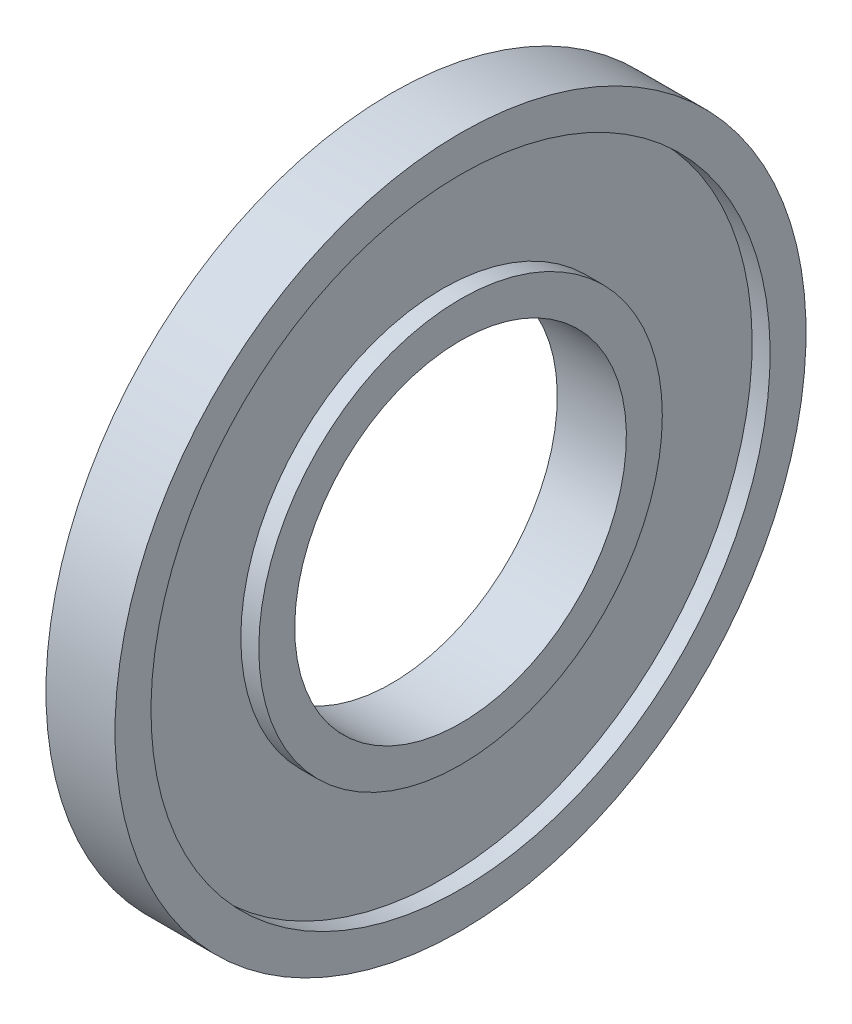
ISO-10303-21;
HEADER;
FILE_DESCRIPTION(('STEP AP214'),'2;1');
FILE_NAME('part.step','',(''),(''),'','','');
FILE_SCHEMA(('AUTOMOTIVE_DESIGN { 1 0 10303 214 1 1 1 1 }'));
ENDSEC;
DATA;
#1=APPLICATION_CONTEXT('core data for automotive mechanical design processes');
#2=APPLICATION_PROTOCOL_DEFINITION('international standard','automotive_design',2000,#1);
#3=PRODUCT_CONTEXT('',#1,'mechanical');
#4=PRODUCT('Part','Part','',(#3));
#5=PRODUCT_RELATED_PRODUCT_CATEGORY('part','',(#4));
#6=PRODUCT_DEFINITION_FORMATION('','',#4);
#7=PRODUCT_DEFINITION_CONTEXT('part definition',#1,'design');
#8=PRODUCT_DEFINITION('design','',#6,#7);
#9=PRODUCT_DEFINITION_SHAPE('','',#8);
#10=(LENGTH_UNIT() NAMED_UNIT(*) SI_UNIT(.MILLI.,.METRE.));
#11=(NAMED_UNIT(*) PLANE_ANGLE_UNIT() SI_UNIT($,.RADIAN.));
#12=(NAMED_UNIT(*) SI_UNIT($,.STERADIAN.) SOLID_ANGLE_UNIT());
#13=UNCERTAINTY_MEASURE_WITH_UNIT(LENGTH_MEASURE(1.E-05),#10,'distance_accuracy_value','');
#14=(GEOMETRIC_REPRESENTATION_CONTEXT(3) GLOBAL_UNCERTAINTY_ASSIGNED_CONTEXT((#13)) GLOBAL_UNIT_ASSIGNED_CONTEXT((#10,
#11,#12)) REPRESENTATION_CONTEXT('',''));
#15=CARTESIAN_POINT('',(0.,0.,0.));
#16=DIRECTION('',(0.,0.,1.));
#17=DIRECTION('',(1.,0.,0.));
#18=AXIS2_PLACEMENT_3D('',#15,#16,#17);
#19=CARTESIAN_POINT('',(-2.5,14.6,0.));
#20=DIRECTION('',(-1.,0.,0.));
#21=DIRECTION('',(0.,-1.,0.));
#22=AXIS2_PLACEMENT_3D('',#19,#20,#21);
#23=PLANE('',#22);
#24=CARTESIAN_POINT('',(-2.5,0.,0.));
#25=DIRECTION('',(1.,0.,0.));
#26=DIRECTION('',(0.,1.,0.));
#27=AXIS2_PLACEMENT_3D('',#24,#25,#26);
#28=CIRCLE('',#27,12.);
#29=CARTESIAN_POINT('',(-2.5,12.,0.));
#30=VERTEX_POINT('',#29);
#31=EDGE_CURVE('E75',#30,#30,#28,.T.);
#32=ORIENTED_EDGE('',*,*,#31,.T.);
#33=EDGE_LOOP('',(#32));
#34=FACE_BOUND('',#33,.T.);
#35=CARTESIAN_POINT('',(-2.5,0.,0.));
#36=DIRECTION('',(1.,0.,0.));
#37=DIRECTION('',(0.,1.,0.));
#38=AXIS2_PLACEMENT_3D('',#35,#36,#37);
#39=CIRCLE('',#38,14.6);
#40=CARTESIAN_POINT('',(-2.5,14.6,0.));
#41=VERTEX_POINT('',#40);
#42=EDGE_CURVE('E10',#41,#41,#39,.T.);
#43=ORIENTED_EDGE('',*,*,#42,.F.);
#44=EDGE_LOOP('',(#43));
#45=FACE_BOUND('',#44,.T.);
#46=ADVANCED_FACE('F35',(#34,#45),#23,.T.);
#47=CARTESIAN_POINT('',(6.48120818860915,0.,0.));
#48=DIRECTION('',(1.,0.,0.));
#49=DIRECTION('',(0.,1.,0.));
#50=AXIS2_PLACEMENT_3D('',#47,#48,#49);
#51=CYLINDRICAL_SURFACE('',#50,14.6);
#52=ORIENTED_EDGE('',*,*,#42,.T.);
#53=EDGE_LOOP('',(#52));
#54=FACE_BOUND('',#53,.T.);
#55=CARTESIAN_POINT('',(-1.2,0.,0.));
#56=DIRECTION('',(1.,0.,0.));
#57=DIRECTION('',(0.,1.,0.));
#58=AXIS2_PLACEMENT_3D('',#55,#56,#57);
#59=CIRCLE('',#58,14.6);
#60=CARTESIAN_POINT('',(-1.2,14.6,0.));
#61=VERTEX_POINT('',#60);
#62=EDGE_CURVE('E41',#61,#61,#59,.T.);
#63=ORIENTED_EDGE('',*,*,#62,.F.);
#64=EDGE_LOOP('',(#63));
#65=FACE_BOUND('',#64,.T.);
#66=ADVANCED_FACE('F93',(#54,#65),#51,.T.);
#67=CARTESIAN_POINT('',(-1.2,22.4,0.));
#68=DIRECTION('',(-1.,0.,0.));
#69=DIRECTION('',(0.,-1.,0.));
#70=AXIS2_PLACEMENT_3D('',#67,#68,#69);
#71=PLANE('',#70);
#72=ORIENTED_EDGE('',*,*,#62,.T.);
#73=EDGE_LOOP('',(#72));
#74=FACE_BOUND('',#73,.T.);
#75=CARTESIAN_POINT('',(-1.2,0.,0.));
#76=DIRECTION('',(1.,0.,0.));
#77=DIRECTION('',(0.,1.,0.));
#78=AXIS2_PLACEMENT_3D('',#75,#76,#77);
#79=CIRCLE('',#78,22.4);
#80=CARTESIAN_POINT('',(-1.2,22.4,0.));
#81=VERTEX_POINT('',#80);
#82=EDGE_CURVE('E45',#81,#81,#79,.T.);
#83=ORIENTED_EDGE('',*,*,#82,.F.);
#84=EDGE_LOOP('',(#83));
#85=FACE_BOUND('',#84,.T.);
#86=ADVANCED_FACE('F97',(#74,#85),#71,.T.);
#87=CARTESIAN_POINT('',(6.48120818860915,0.,0.));
#88=DIRECTION('',(1.,0.,0.));
#89=DIRECTION('',(0.,1.,0.));
#90=AXIS2_PLACEMENT_3D('',#87,#88,#89);
#91=CYLINDRICAL_SURFACE('',#90,22.4);
#92=ORIENTED_EDGE('',*,*,#82,.T.);
#93=EDGE_LOOP('',(#92));
#94=FACE_BOUND('',#93,.T.);
#95=CARTESIAN_POINT('',(-2.5,0.,0.));
#96=DIRECTION('',(1.,0.,0.));
#97=DIRECTION('',(0.,1.,0.));
#98=AXIS2_PLACEMENT_3D('',#95,#96,#97);
#99=CIRCLE('',#98,22.4);
#100=CARTESIAN_POINT('',(-2.5,22.4,0.));
#101=VERTEX_POINT('',#100);
#102=EDGE_CURVE('E49',#101,#101,#99,.T.);
#103=ORIENTED_EDGE('',*,*,#102,.F.);
#104=EDGE_LOOP('',(#103));
#105=FACE_BOUND('',#104,.T.);
#106=ADVANCED_FACE('F101',(#94,#105),#91,.F.);
#107=CARTESIAN_POINT('',(-2.5,25.,0.));
#108=DIRECTION('',(-1.,0.,0.));
#109=DIRECTION('',(0.,-1.,0.));
#110=AXIS2_PLACEMENT_3D('',#107,#108,#109);
#111=PLANE('',#110);
#112=ORIENTED_EDGE('',*,*,#102,.T.);
#113=EDGE_LOOP('',(#112));
#114=FACE_BOUND('',#113,.T.);
#115=CARTESIAN_POINT('',(-2.5,0.,0.));
#116=DIRECTION('',(1.,0.,0.));
#117=DIRECTION('',(0.,1.,0.));
#118=AXIS2_PLACEMENT_3D('',#115,#116,#117);
#119=CIRCLE('',#118,25.);
#120=CARTESIAN_POINT('',(-2.5,25.,0.));
#121=VERTEX_POINT('',#120);
#122=EDGE_CURVE('E54',#121,#121,#119,.T.);
#123=ORIENTED_EDGE('',*,*,#122,.F.);
#124=EDGE_LOOP('',(#123));
#125=FACE_BOUND('',#124,.T.);
#126=ADVANCED_FACE('F107',(#114,#125),#111,.T.);
#127=CARTESIAN_POINT('',(6.48120818860915,0.,0.));
#128=DIRECTION('',(1.,0.,0.));
#129=DIRECTION('',(0.,1.,0.));
#130=AXIS2_PLACEMENT_3D('',#127,#128,#129);
#131=CYLINDRICAL_SURFACE('',#130,25.);
#132=ORIENTED_EDGE('',*,*,#122,.T.);
#133=EDGE_LOOP('',(#132));
#134=FACE_BOUND('',#133,.T.);
#135=CARTESIAN_POINT('',(2.5,0.,0.));
#136=DIRECTION('',(1.,0.,0.));
#137=DIRECTION('',(0.,1.,0.));
#138=AXIS2_PLACEMENT_3D('',#135,#136,#137);
#139=CIRCLE('',#138,25.);
#140=CARTESIAN_POINT('',(2.5,25.,0.));
#141=VERTEX_POINT('',#140);
#142=EDGE_CURVE('E57',#141,#141,#139,.T.);
#143=ORIENTED_EDGE('',*,*,#142,.F.);
#144=EDGE_LOOP('',(#143));
#145=FACE_BOUND('',#144,.T.);
#146=ADVANCED_FACE('F111',(#134,#145),#131,.T.);
#147=CARTESIAN_POINT('',(2.5,25.,0.));
#148=DIRECTION('',(1.,0.,0.));
#149=DIRECTION('',(0.,1.,0.));
#150=AXIS2_PLACEMENT_3D('',#147,#148,#149);
#151=PLANE('',#150);
#152=ORIENTED_EDGE('',*,*,#142,.T.);
#153=EDGE_LOOP('',(#152));
#154=FACE_BOUND('',#153,.T.);
#155=CARTESIAN_POINT('',(2.5,0.,0.));
#156=DIRECTION('',(1.,0.,0.));
#157=DIRECTION('',(0.,1.,0.));
#158=AXIS2_PLACEMENT_3D('',#155,#156,#157);
#159=CIRCLE('',#158,22.4);
#160=CARTESIAN_POINT('',(2.5,22.4,0.));
#161=VERTEX_POINT('',#160);
#162=EDGE_CURVE('E60',#161,#161,#159,.T.);
#163=ORIENTED_EDGE('',*,*,#162,.F.);
#164=EDGE_LOOP('',(#163));
#165=FACE_BOUND('',#164,.T.);
#166=ADVANCED_FACE('F115',(#154,#165),#151,.T.);
#167=CARTESIAN_POINT('',(6.48120818860915,0.,0.));
#168=DIRECTION('',(1.,0.,0.));
#169=DIRECTION('',(0.,1.,0.));
#170=AXIS2_PLACEMENT_3D('',#167,#168,#169);
#171=CYLINDRICAL_SURFACE('',#170,22.4);
#172=ORIENTED_EDGE('',*,*,#162,.T.);
#173=EDGE_LOOP('',(#172));
#174=FACE_BOUND('',#173,.T.);
#175=CARTESIAN_POINT('',(1.20000000000001,0.,0.));
#176=DIRECTION('',(1.,0.,0.));
#177=DIRECTION('',(0.,1.,0.));
#178=AXIS2_PLACEMENT_3D('',#175,#176,#177);
#179=CIRCLE('',#178,22.4);
#180=CARTESIAN_POINT('',(1.20000000000001,22.4,0.));
#181=VERTEX_POINT('',#180);
#182=EDGE_CURVE('E63',#181,#181,#179,.T.);
#183=ORIENTED_EDGE('',*,*,#182,.F.);
#184=EDGE_LOOP('',(#183));
#185=FACE_BOUND('',#184,.T.);
#186=ADVANCED_FACE('F119',(#174,#185),#171,.F.);
#187=CARTESIAN_POINT('',(1.2,22.4,0.));
#188=DIRECTION('',(1.,0.,0.));
#189=DIRECTION('',(0.,1.,0.));
#190=AXIS2_PLACEMENT_3D('',#187,#188,#189);
#191=PLANE('',#190);
#192=ORIENTED_EDGE('',*,*,#182,.T.);
#193=EDGE_LOOP('',(#192));
#194=FACE_BOUND('',#193,.T.);
#195=CARTESIAN_POINT('',(1.20000000000001,0.,0.));
#196=DIRECTION('',(1.,0.,0.));
#197=DIRECTION('',(0.,1.,0.));
#198=AXIS2_PLACEMENT_3D('',#195,#196,#197);
#199=CIRCLE('',#198,14.6);
#200=CARTESIAN_POINT('',(1.20000000000001,14.6,0.));
#201=VERTEX_POINT('',#200);
#202=EDGE_CURVE('E66',#201,#201,#199,.T.);
#203=ORIENTED_EDGE('',*,*,#202,.F.);
#204=EDGE_LOOP('',(#203));
#205=FACE_BOUND('',#204,.T.);
#206=ADVANCED_FACE('F123',(#194,#205),#191,.T.);
#207=CARTESIAN_POINT('',(6.48120818860915,0.,0.));
#208=DIRECTION('',(1.,0.,0.));
#209=DIRECTION('',(0.,1.,0.));
#210=AXIS2_PLACEMENT_3D('',#207,#208,#209);
#211=CYLINDRICAL_SURFACE('',#210,14.6);
#212=ORIENTED_EDGE('',*,*,#202,.T.);
#213=EDGE_LOOP('',(#212));
#214=FACE_BOUND('',#213,.T.);
#215=CARTESIAN_POINT('',(2.5,0.,0.));
#216=DIRECTION('',(1.,0.,0.));
#217=DIRECTION('',(0.,1.,0.));
#218=AXIS2_PLACEMENT_3D('',#215,#216,#217);
#219=CIRCLE('',#218,14.6);
#220=CARTESIAN_POINT('',(2.5,14.6,0.));
#221=VERTEX_POINT('',#220);
#222=EDGE_CURVE('E69',#221,#221,#219,.T.);
#223=ORIENTED_EDGE('',*,*,#222,.F.);
#224=EDGE_LOOP('',(#223));
#225=FACE_BOUND('',#224,.T.);
#226=ADVANCED_FACE('F89',(#214,#225),#211,.T.);
#227=CARTESIAN_POINT('',(2.5,14.6,0.));
#228=DIRECTION('',(1.,0.,0.));
#229=DIRECTION('',(0.,1.,0.));
#230=AXIS2_PLACEMENT_3D('',#227,#228,#229);
#231=PLANE('',#230);
#232=ORIENTED_EDGE('',*,*,#222,.T.);
#233=EDGE_LOOP('',(#232));
#234=FACE_BOUND('',#233,.T.);
#235=CARTESIAN_POINT('',(2.5,0.,0.));
#236=DIRECTION('',(1.,0.,0.));
#237=DIRECTION('',(0.,1.,0.));
#238=AXIS2_PLACEMENT_3D('',#235,#236,#237);
#239=CIRCLE('',#238,12.);
#240=CARTESIAN_POINT('',(2.5,12.,0.));
#241=VERTEX_POINT('',#240);
#242=EDGE_CURVE('E72',#241,#241,#239,.T.);
#243=ORIENTED_EDGE('',*,*,#242,.F.);
#244=EDGE_LOOP('',(#243));
#245=FACE_BOUND('',#244,.T.);
#246=ADVANCED_FACE('F83',(#234,#245),#231,.T.);
#247=CARTESIAN_POINT('',(6.48120818860915,0.,0.));
#248=DIRECTION('',(1.,0.,0.));
#249=DIRECTION('',(0.,1.,0.));
#250=AXIS2_PLACEMENT_3D('',#247,#248,#249);
#251=CYLINDRICAL_SURFACE('',#250,12.);
#252=ORIENTED_EDGE('',*,*,#242,.T.);
#253=EDGE_LOOP('',(#252));
#254=FACE_BOUND('',#253,.T.);
#255=ORIENTED_EDGE('',*,*,#31,.F.);
#256=EDGE_LOOP('',(#255));
#257=FACE_BOUND('',#256,.T.);
#258=ADVANCED_FACE('F81',(#254,#257),#251,.F.);
#259=CLOSED_SHELL('',(#46,#66,#86,#106,#126,#146,#166,#186,#206,#226,#246,#258));
#260=MANIFOLD_SOLID_BREP('B2',#259);
#261=ADVANCED_BREP_SHAPE_REPRESENTATION('',(#18,#260),#14);
#262=SHAPE_DEFINITION_REPRESENTATION(#9,#261);
ENDSEC;
END-ISO-10303-21;
